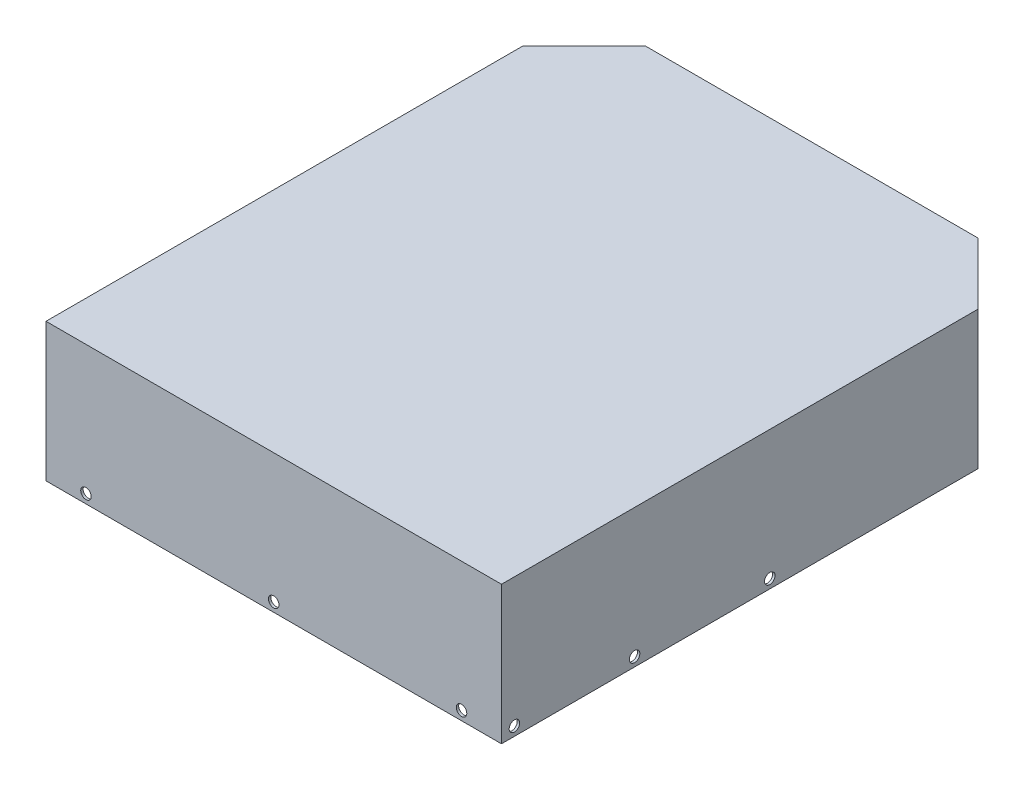
ISO-10303-21;
HEADER;
FILE_DESCRIPTION(('STEP AP214'),'2;1');
FILE_NAME('part.step','',(''),(''),'','','');
FILE_SCHEMA(('AUTOMOTIVE_DESIGN { 1 0 10303 214 1 1 1 1 }'));
ENDSEC;
DATA;
#1=APPLICATION_CONTEXT('core data for automotive mechanical design processes');
#2=APPLICATION_PROTOCOL_DEFINITION('international standard','automotive_design',2000,#1);
#3=PRODUCT_CONTEXT('',#1,'mechanical');
#4=PRODUCT('Part','Part','',(#3));
#5=PRODUCT_RELATED_PRODUCT_CATEGORY('part','',(#4));
#6=PRODUCT_DEFINITION_FORMATION('','',#4);
#7=PRODUCT_DEFINITION_CONTEXT('part definition',#1,'design');
#8=PRODUCT_DEFINITION('design','',#6,#7);
#9=PRODUCT_DEFINITION_SHAPE('','',#8);
#10=(LENGTH_UNIT() NAMED_UNIT(*) SI_UNIT(.MILLI.,.METRE.));
#11=(NAMED_UNIT(*) PLANE_ANGLE_UNIT() SI_UNIT($,.RADIAN.));
#12=(NAMED_UNIT(*) SI_UNIT($,.STERADIAN.) SOLID_ANGLE_UNIT());
#13=UNCERTAINTY_MEASURE_WITH_UNIT(LENGTH_MEASURE(1.E-05),#10,'distance_accuracy_value','');
#14=(GEOMETRIC_REPRESENTATION_CONTEXT(3) GLOBAL_UNCERTAINTY_ASSIGNED_CONTEXT((#13)) GLOBAL_UNIT_ASSIGNED_CONTEXT((#10,
#11,#12)) REPRESENTATION_CONTEXT('',''));
#15=CARTESIAN_POINT('',(0.,0.,0.));
#16=DIRECTION('',(0.,0.,1.));
#17=DIRECTION('',(1.,0.,0.));
#18=AXIS2_PLACEMENT_3D('',#15,#16,#17);
#19=CARTESIAN_POINT('',(-151.6,92.,0.));
#20=DIRECTION('',(0.,0.,-1.));
#21=DIRECTION('',(-1.,0.,0.));
#22=AXIS2_PLACEMENT_3D('',#19,#20,#21);
#23=PLANE('',#22);
#24=CARTESIAN_POINT('',(-125.,6.00000000000001,0.));
#25=DIRECTION('',(0.,0.,1.));
#26=DIRECTION('',(1.,0.,0.));
#27=AXIS2_PLACEMENT_3D('',#24,#25,#26);
#28=CIRCLE('',#27,3.49999999999999);
#29=CARTESIAN_POINT('',(-121.5,6.00000000000001,0.));
#30=VERTEX_POINT('',#29);
#31=EDGE_CURVE('E248',#30,#30,#28,.T.);
#32=ORIENTED_EDGE('',*,*,#31,.F.);
#33=EDGE_LOOP('',(#32));
#34=FACE_BOUND('',#33,.T.);
#35=DIRECTION('',(1.,0.,0.));
#36=VECTOR('',#35,1.);
#37=CARTESIAN_POINT('',(-151.6,0.,0.));
#38=LINE('',#37,#36);
#39=CARTESIAN_POINT('',(-151.6,0.,0.));
#40=VERTEX_POINT('',#39);
#41=CARTESIAN_POINT('',(151.6,0.,0.));
#42=VERTEX_POINT('',#41);
#43=EDGE_CURVE('E193',#40,#42,#38,.T.);
#44=ORIENTED_EDGE('',*,*,#43,.T.);
#45=DIRECTION('',(0.,-1.,0.));
#46=VECTOR('',#45,1.);
#47=CARTESIAN_POINT('',(151.6,92.,0.));
#48=LINE('',#47,#46);
#49=CARTESIAN_POINT('',(151.6,92.,0.));
#50=VERTEX_POINT('',#49);
#51=EDGE_CURVE('E191',#50,#42,#48,.T.);
#52=ORIENTED_EDGE('',*,*,#51,.F.);
#53=DIRECTION('',(1.,0.,0.));
#54=VECTOR('',#53,1.);
#55=CARTESIAN_POINT('',(-151.6,92.,0.));
#56=LINE('',#55,#54);
#57=CARTESIAN_POINT('',(-151.6,92.,0.));
#58=VERTEX_POINT('',#57);
#59=EDGE_CURVE('E183',#58,#50,#56,.T.);
#60=ORIENTED_EDGE('',*,*,#59,.F.);
#61=DIRECTION('',(0.,-1.,0.));
#62=VECTOR('',#61,1.);
#63=CARTESIAN_POINT('',(-151.6,92.,0.));
#64=LINE('',#63,#62);
#65=EDGE_CURVE('E201',#58,#40,#64,.T.);
#66=ORIENTED_EDGE('',*,*,#65,.T.);
#67=EDGE_LOOP('',(#44,#52,#60,#66));
#68=FACE_BOUND('',#67,.T.);
#69=CARTESIAN_POINT('',(125.,6.00000000000001,0.));
#70=DIRECTION('',(0.,0.,1.));
#71=DIRECTION('',(1.,0.,0.));
#72=AXIS2_PLACEMENT_3D('',#69,#70,#71);
#73=CIRCLE('',#72,3.49999999999998);
#74=CARTESIAN_POINT('',(128.5,6.00000000000001,0.));
#75=VERTEX_POINT('',#74);
#76=EDGE_CURVE('E260',#75,#75,#73,.T.);
#77=ORIENTED_EDGE('',*,*,#76,.F.);
#78=EDGE_LOOP('',(#77));
#79=FACE_BOUND('',#78,.T.);
#80=CARTESIAN_POINT('',(0.,6.00000000000001,0.));
#81=DIRECTION('',(0.,0.,1.));
#82=DIRECTION('',(1.,0.,0.));
#83=AXIS2_PLACEMENT_3D('',#80,#81,#82);
#84=CIRCLE('',#83,3.49999999999999);
#85=CARTESIAN_POINT('',(3.49999999999999,6.00000000000001,0.));
#86=VERTEX_POINT('',#85);
#87=EDGE_CURVE('E254',#86,#86,#84,.T.);
#88=ORIENTED_EDGE('',*,*,#87,.F.);
#89=EDGE_LOOP('',(#88));
#90=FACE_BOUND('',#89,.T.);
#91=ADVANCED_FACE('F32',(#34,#68,#79,#90),#23,.F.);
#92=CARTESIAN_POINT('',(-151.6,0.,-358.2));
#93=DIRECTION('',(0.,-1.,0.));
#94=DIRECTION('',(0.,0.,-1.));
#95=AXIS2_PLACEMENT_3D('',#92,#93,#94);
#96=PLANE('',#95);
#97=DIRECTION('',(0.,0.,1.));
#98=VECTOR('',#97,1.);
#99=CARTESIAN_POINT('',(-151.6,0.,0.));
#100=LINE('',#99,#98);
#101=CARTESIAN_POINT('',(-151.6,0.,-317.2));
#102=VERTEX_POINT('',#101);
#103=EDGE_CURVE('E159',#102,#40,#100,.T.);
#104=ORIENTED_EDGE('',*,*,#103,.F.);
#105=DIRECTION('',(-0.707106781186549,0.,0.707106781186546));
#106=VECTOR('',#105,1.);
#107=CARTESIAN_POINT('',(-131.1,0.,-337.7));
#108=LINE('',#107,#106);
#109=CARTESIAN_POINT('',(-110.6,0.,-358.2));
#110=VERTEX_POINT('',#109);
#111=EDGE_CURVE('E209',#102,#110,#108,.F.);
#112=ORIENTED_EDGE('',*,*,#111,.T.);
#113=DIRECTION('',(-1.,0.,0.));
#114=VECTOR('',#113,1.);
#115=CARTESIAN_POINT('',(-151.6,0.,-358.2));
#116=LINE('',#115,#114);
#117=CARTESIAN_POINT('',(110.6,0.,-358.2));
#118=VERTEX_POINT('',#117);
#119=EDGE_CURVE('E184',#118,#110,#116,.T.);
#120=ORIENTED_EDGE('',*,*,#119,.F.);
#121=DIRECTION('',(-0.707106781186547,0.,-0.707106781186549));
#122=VECTOR('',#121,1.);
#123=CARTESIAN_POINT('',(-20.4999999999996,0.,-489.3));
#124=LINE('',#123,#122);
#125=CARTESIAN_POINT('',(151.6,0.,-317.2));
#126=VERTEX_POINT('',#125);
#127=EDGE_CURVE('E207',#118,#126,#124,.F.);
#128=ORIENTED_EDGE('',*,*,#127,.T.);
#129=DIRECTION('',(0.,0.,-1.));
#130=VECTOR('',#129,1.);
#131=CARTESIAN_POINT('',(151.6,0.,0.));
#132=LINE('',#131,#130);
#133=EDGE_CURVE('E195',#42,#126,#132,.T.);
#134=ORIENTED_EDGE('',*,*,#133,.F.);
#135=ORIENTED_EDGE('',*,*,#43,.F.);
#136=EDGE_LOOP('',(#104,#112,#120,#128,#134,#135));
#137=FACE_BOUND('',#136,.T.);
#138=DIRECTION('',(-0.707106781186549,0.,0.707106781186546));
#139=VECTOR('',#138,1.);
#140=CARTESIAN_POINT('',(-129.968629150102,0.,-336.568629150101));
#141=LINE('',#140,#139);
#142=CARTESIAN_POINT('',(-150.,0.,-316.537258300203));
#143=VERTEX_POINT('',#142);
#144=CARTESIAN_POINT('',(-109.937258300203,0.,-356.6));
#145=VERTEX_POINT('',#144);
#146=EDGE_CURVE('E171',#143,#145,#141,.F.);
#147=ORIENTED_EDGE('',*,*,#146,.F.);
#148=DIRECTION('',(0.,0.,1.));
#149=VECTOR('',#148,1.);
#150=CARTESIAN_POINT('',(-150.,0.,-358.2));
#151=LINE('',#150,#149);
#152=CARTESIAN_POINT('',(-150.,0.,-1.6));
#153=VERTEX_POINT('',#152);
#154=EDGE_CURVE('E172',#143,#153,#151,.T.);
#155=ORIENTED_EDGE('',*,*,#154,.T.);
#156=DIRECTION('',(1.,0.,0.));
#157=VECTOR('',#156,1.);
#158=CARTESIAN_POINT('',(-151.6,0.,-1.59999999999999));
#159=LINE('',#158,#157);
#160=CARTESIAN_POINT('',(150.,0.,-1.6));
#161=VERTEX_POINT('',#160);
#162=EDGE_CURVE('E149',#153,#161,#159,.T.);
#163=ORIENTED_EDGE('',*,*,#162,.T.);
#164=DIRECTION('',(0.,0.,-1.));
#165=VECTOR('',#164,1.);
#166=CARTESIAN_POINT('',(150.,0.,-358.2));
#167=LINE('',#166,#165);
#168=CARTESIAN_POINT('',(150.,0.,-316.537258300203));
#169=VERTEX_POINT('',#168);
#170=EDGE_CURVE('E49',#161,#169,#167,.T.);
#171=ORIENTED_EDGE('',*,*,#170,.T.);
#172=DIRECTION('',(-0.707106781186547,0.,-0.707106781186549));
#173=VECTOR('',#172,1.);
#174=CARTESIAN_POINT('',(-21.6313708498981,0.,-488.168629150101));
#175=LINE('',#174,#173);
#176=CARTESIAN_POINT('',(109.937258300203,0.,-356.6));
#177=VERTEX_POINT('',#176);
#178=EDGE_CURVE('E152',#177,#169,#175,.F.);
#179=ORIENTED_EDGE('',*,*,#178,.F.);
#180=DIRECTION('',(-1.,0.,0.));
#181=VECTOR('',#180,1.);
#182=CARTESIAN_POINT('',(-151.6,0.,-356.6));
#183=LINE('',#182,#181);
#184=EDGE_CURVE('E137',#177,#145,#183,.T.);
#185=ORIENTED_EDGE('',*,*,#184,.T.);
#186=EDGE_LOOP('',(#147,#155,#163,#171,#179,#185));
#187=FACE_BOUND('',#186,.T.);
#188=ADVANCED_FACE('F284',(#137,#187),#96,.T.);
#189=CARTESIAN_POINT('',(-151.6,92.,0.));
#190=DIRECTION('',(1.,0.,0.));
#191=DIRECTION('',(0.,0.,-1.));
#192=AXIS2_PLACEMENT_3D('',#189,#190,#191);
#193=PLANE('',#192);
#194=CARTESIAN_POINT('',(-151.6,6.00000000000001,-8.6));
#195=DIRECTION('',(-1.,0.,0.));
#196=DIRECTION('',(0.,0.,1.));
#197=AXIS2_PLACEMENT_3D('',#194,#195,#196);
#198=CIRCLE('',#197,3.49999999999999);
#199=CARTESIAN_POINT('',(-151.6,6.00000000000001,-5.10000000000001));
#200=VERTEX_POINT('',#199);
#201=EDGE_CURVE('E508',#200,#200,#198,.T.);
#202=ORIENTED_EDGE('',*,*,#201,.F.);
#203=EDGE_LOOP('',(#202));
#204=FACE_BOUND('',#203,.T.);
#205=CARTESIAN_POINT('',(-151.6,6.00000000000001,-88.6));
#206=DIRECTION('',(-1.,0.,0.));
#207=DIRECTION('',(0.,0.,1.));
#208=AXIS2_PLACEMENT_3D('',#205,#206,#207);
#209=CIRCLE('',#208,3.49999999999999);
#210=CARTESIAN_POINT('',(-151.6,6.00000000000001,-85.1));
#211=VERTEX_POINT('',#210);
#212=EDGE_CURVE('E233',#211,#211,#209,.T.);
#213=ORIENTED_EDGE('',*,*,#212,.F.);
#214=EDGE_LOOP('',(#213));
#215=FACE_BOUND('',#214,.T.);
#216=CARTESIAN_POINT('',(-151.6,6.00000000000001,-178.6));
#217=DIRECTION('',(-1.,0.,0.));
#218=DIRECTION('',(0.,0.,1.));
#219=AXIS2_PLACEMENT_3D('',#216,#217,#218);
#220=CIRCLE('',#219,3.49999999999999);
#221=CARTESIAN_POINT('',(-151.6,6.00000000000001,-175.1));
#222=VERTEX_POINT('',#221);
#223=EDGE_CURVE('E230',#222,#222,#220,.T.);
#224=ORIENTED_EDGE('',*,*,#223,.F.);
#225=EDGE_LOOP('',(#224));
#226=FACE_BOUND('',#225,.T.);
#227=DIRECTION('',(0.,0.,1.));
#228=VECTOR('',#227,1.);
#229=CARTESIAN_POINT('',(-151.6,92.,0.));
#230=LINE('',#229,#228);
#231=CARTESIAN_POINT('',(-151.6,92.,-317.2));
#232=VERTEX_POINT('',#231);
#233=EDGE_CURVE('E181',#232,#58,#230,.T.);
#234=ORIENTED_EDGE('',*,*,#233,.F.);
#235=DIRECTION('',(0.,-1.,0.));
#236=VECTOR('',#235,1.);
#237=CARTESIAN_POINT('',(-151.6,92.,-317.2));
#238=LINE('',#237,#236);
#239=EDGE_CURVE('E204',#232,#102,#238,.T.);
#240=ORIENTED_EDGE('',*,*,#239,.T.);
#241=ORIENTED_EDGE('',*,*,#103,.T.);
#242=ORIENTED_EDGE('',*,*,#65,.F.);
#243=EDGE_LOOP('',(#234,#240,#241,#242));
#244=FACE_BOUND('',#243,.T.);
#245=ADVANCED_FACE('F290',(#204,#215,#226,#244),#193,.F.);
#246=CARTESIAN_POINT('',(151.6,92.,0.));
#247=DIRECTION('',(-1.,0.,0.));
#248=DIRECTION('',(0.,0.,1.));
#249=AXIS2_PLACEMENT_3D('',#246,#247,#248);
#250=PLANE('',#249);
#251=CARTESIAN_POINT('',(151.6,6.00000000000001,-8.6));
#252=DIRECTION('',(-1.,0.,0.));
#253=DIRECTION('',(0.,0.,1.));
#254=AXIS2_PLACEMENT_3D('',#251,#252,#253);
#255=CIRCLE('',#254,3.49999999999996);
#256=CARTESIAN_POINT('',(151.6,6.00000000000001,-5.10000000000004));
#257=VERTEX_POINT('',#256);
#258=EDGE_CURVE('E338',#257,#257,#255,.T.);
#259=ORIENTED_EDGE('',*,*,#258,.T.);
#260=EDGE_LOOP('',(#259));
#261=FACE_BOUND('',#260,.T.);
#262=CARTESIAN_POINT('',(151.6,6.00000000000001,-88.6));
#263=DIRECTION('',(-1.,0.,0.));
#264=DIRECTION('',(0.,0.,1.));
#265=AXIS2_PLACEMENT_3D('',#262,#263,#264);
#266=CIRCLE('',#265,3.49999999999996);
#267=CARTESIAN_POINT('',(151.6,6.00000000000001,-85.1));
#268=VERTEX_POINT('',#267);
#269=EDGE_CURVE('E226',#268,#268,#266,.T.);
#270=ORIENTED_EDGE('',*,*,#269,.T.);
#271=EDGE_LOOP('',(#270));
#272=FACE_BOUND('',#271,.T.);
#273=CARTESIAN_POINT('',(151.6,6.00000000000001,-178.6));
#274=DIRECTION('',(-1.,0.,0.));
#275=DIRECTION('',(0.,0.,1.));
#276=AXIS2_PLACEMENT_3D('',#273,#274,#275);
#277=CIRCLE('',#276,3.49999999999996);
#278=CARTESIAN_POINT('',(151.6,6.00000000000001,-175.1));
#279=VERTEX_POINT('',#278);
#280=EDGE_CURVE('E222',#279,#279,#277,.T.);
#281=ORIENTED_EDGE('',*,*,#280,.T.);
#282=EDGE_LOOP('',(#281));
#283=FACE_BOUND('',#282,.T.);
#284=ORIENTED_EDGE('',*,*,#133,.T.);
#285=DIRECTION('',(0.,1.,0.));
#286=VECTOR('',#285,1.);
#287=CARTESIAN_POINT('',(151.6,92.,-317.2));
#288=LINE('',#287,#286);
#289=CARTESIAN_POINT('',(151.6,92.,-317.2));
#290=VERTEX_POINT('',#289);
#291=EDGE_CURVE('E11',#126,#290,#288,.T.);
#292=ORIENTED_EDGE('',*,*,#291,.T.);
#293=DIRECTION('',(0.,0.,-1.));
#294=VECTOR('',#293,1.);
#295=CARTESIAN_POINT('',(151.6,92.,0.));
#296=LINE('',#295,#294);
#297=EDGE_CURVE('E186',#50,#290,#296,.T.);
#298=ORIENTED_EDGE('',*,*,#297,.F.);
#299=ORIENTED_EDGE('',*,*,#51,.T.);
#300=EDGE_LOOP('',(#284,#292,#298,#299));
#301=FACE_BOUND('',#300,.T.);
#302=ADVANCED_FACE('F297',(#261,#272,#283,#301),#250,.F.);
#303=CARTESIAN_POINT('',(-151.6,92.,-358.2));
#304=DIRECTION('',(0.,0.,1.));
#305=DIRECTION('',(1.,0.,0.));
#306=AXIS2_PLACEMENT_3D('',#303,#304,#305);
#307=PLANE('',#306);
#308=ORIENTED_EDGE('',*,*,#119,.T.);
#309=DIRECTION('',(0.,1.,0.));
#310=VECTOR('',#309,1.);
#311=CARTESIAN_POINT('',(-110.6,92.,-358.2));
#312=LINE('',#311,#310);
#313=CARTESIAN_POINT('',(-110.6,92.,-358.2));
#314=VERTEX_POINT('',#313);
#315=EDGE_CURVE('E214',#110,#314,#312,.T.);
#316=ORIENTED_EDGE('',*,*,#315,.T.);
#317=DIRECTION('',(-1.,0.,0.));
#318=VECTOR('',#317,1.);
#319=CARTESIAN_POINT('',(-151.6,92.,-358.2));
#320=LINE('',#319,#318);
#321=CARTESIAN_POINT('',(110.6,92.,-358.2));
#322=VERTEX_POINT('',#321);
#323=EDGE_CURVE('E188',#322,#314,#320,.T.);
#324=ORIENTED_EDGE('',*,*,#323,.F.);
#325=DIRECTION('',(0.,-1.,0.));
#326=VECTOR('',#325,1.);
#327=CARTESIAN_POINT('',(110.6,92.,-358.2));
#328=LINE('',#327,#326);
#329=EDGE_CURVE('E211',#322,#118,#328,.T.);
#330=ORIENTED_EDGE('',*,*,#329,.T.);
#331=EDGE_LOOP('',(#308,#316,#324,#330));
#332=FACE_BOUND('',#331,.T.);
#333=ADVANCED_FACE('F310',(#332),#307,.F.);
#334=CARTESIAN_POINT('',(-151.6,92.,-358.2));
#335=DIRECTION('',(0.,-1.,0.));
#336=DIRECTION('',(0.,0.,-1.));
#337=AXIS2_PLACEMENT_3D('',#334,#335,#336);
#338=PLANE('',#337);
#339=ORIENTED_EDGE('',*,*,#323,.T.);
#340=DIRECTION('',(0.707106781186549,0.,-0.707106781186546));
#341=VECTOR('',#340,1.);
#342=CARTESIAN_POINT('',(-151.6,92.,-317.2));
#343=LINE('',#342,#341);
#344=EDGE_CURVE('E41',#314,#232,#343,.F.);
#345=ORIENTED_EDGE('',*,*,#344,.T.);
#346=ORIENTED_EDGE('',*,*,#233,.T.);
#347=ORIENTED_EDGE('',*,*,#59,.T.);
#348=ORIENTED_EDGE('',*,*,#297,.T.);
#349=DIRECTION('',(0.707106781186547,0.,0.707106781186549));
#350=VECTOR('',#349,1.);
#351=CARTESIAN_POINT('',(110.6,92.,-358.2));
#352=LINE('',#351,#350);
#353=EDGE_CURVE('E216',#290,#322,#352,.F.);
#354=ORIENTED_EDGE('',*,*,#353,.T.);
#355=EDGE_LOOP('',(#339,#345,#346,#347,#348,#354));
#356=FACE_BOUND('',#355,.T.);
#357=ADVANCED_FACE('F303',(#356),#338,.F.);
#358=CARTESIAN_POINT('',(-151.6,92.,-317.2));
#359=DIRECTION('',(0.707106781186546,0.,0.707106781186549));
#360=DIRECTION('',(0.707106781186549,0.,-0.707106781186546));
#361=AXIS2_PLACEMENT_3D('',#358,#359,#360);
#362=PLANE('',#361);
#363=ORIENTED_EDGE('',*,*,#344,.F.);
#364=ORIENTED_EDGE('',*,*,#315,.F.);
#365=ORIENTED_EDGE('',*,*,#111,.F.);
#366=ORIENTED_EDGE('',*,*,#239,.F.);
#367=EDGE_LOOP('',(#363,#364,#365,#366));
#368=FACE_BOUND('',#367,.T.);
#369=ADVANCED_FACE('F301',(#368),#362,.F.);
#370=CARTESIAN_POINT('',(110.6,92.,-358.2));
#371=DIRECTION('',(-0.707106781186549,0.,0.707106781186547));
#372=DIRECTION('',(0.707106781186547,0.,0.707106781186549));
#373=AXIS2_PLACEMENT_3D('',#370,#371,#372);
#374=PLANE('',#373);
#375=ORIENTED_EDGE('',*,*,#353,.F.);
#376=ORIENTED_EDGE('',*,*,#291,.F.);
#377=ORIENTED_EDGE('',*,*,#127,.F.);
#378=ORIENTED_EDGE('',*,*,#329,.F.);
#379=EDGE_LOOP('',(#375,#376,#377,#378));
#380=FACE_BOUND('',#379,.T.);
#381=ADVANCED_FACE('F34',(#380),#374,.F.);
#382=CARTESIAN_POINT('',(-150.,92.,0.));
#383=DIRECTION('',(1.,0.,0.));
#384=DIRECTION('',(0.,0.,-1.));
#385=AXIS2_PLACEMENT_3D('',#382,#383,#384);
#386=PLANE('',#385);
#387=CARTESIAN_POINT('',(-150.,6.00000000000001,-8.6));
#388=DIRECTION('',(1.,0.,0.));
#389=DIRECTION('',(0.,0.,-1.));
#390=AXIS2_PLACEMENT_3D('',#387,#388,#389);
#391=CIRCLE('',#390,3.49999999999998);
#392=CARTESIAN_POINT('',(-150.,6.00000000000001,-12.1));
#393=VERTEX_POINT('',#392);
#394=EDGE_CURVE('E238',#393,#393,#391,.T.);
#395=ORIENTED_EDGE('',*,*,#394,.F.);
#396=EDGE_LOOP('',(#395));
#397=FACE_BOUND('',#396,.T.);
#398=CARTESIAN_POINT('',(-150.,6.00000000000001,-88.6));
#399=DIRECTION('',(1.,0.,0.));
#400=DIRECTION('',(0.,0.,-1.));
#401=AXIS2_PLACEMENT_3D('',#398,#399,#400);
#402=CIRCLE('',#401,3.49999999999998);
#403=CARTESIAN_POINT('',(-150.,6.00000000000001,-92.1));
#404=VERTEX_POINT('',#403);
#405=EDGE_CURVE('E225',#404,#404,#402,.T.);
#406=ORIENTED_EDGE('',*,*,#405,.F.);
#407=EDGE_LOOP('',(#406));
#408=FACE_BOUND('',#407,.T.);
#409=CARTESIAN_POINT('',(-150.,6.00000000000001,-178.6));
#410=DIRECTION('',(1.,0.,0.));
#411=DIRECTION('',(0.,0.,-1.));
#412=AXIS2_PLACEMENT_3D('',#409,#410,#411);
#413=CIRCLE('',#412,3.49999999999998);
#414=CARTESIAN_POINT('',(-150.,6.00000000000001,-182.1));
#415=VERTEX_POINT('',#414);
#416=EDGE_CURVE('E219',#415,#415,#413,.T.);
#417=ORIENTED_EDGE('',*,*,#416,.F.);
#418=EDGE_LOOP('',(#417));
#419=FACE_BOUND('',#418,.T.);
#420=DIRECTION('',(0.,0.,1.));
#421=VECTOR('',#420,1.);
#422=CARTESIAN_POINT('',(-150.,90.4,-358.2));
#423=LINE('',#422,#421);
#424=CARTESIAN_POINT('',(-150.,90.4,-316.537258300203));
#425=VERTEX_POINT('',#424);
#426=CARTESIAN_POINT('',(-150.,90.4,-1.6));
#427=VERTEX_POINT('',#426);
#428=EDGE_CURVE('E126',#425,#427,#423,.T.);
#429=ORIENTED_EDGE('',*,*,#428,.T.);
#430=DIRECTION('',(0.,-1.,0.));
#431=VECTOR('',#430,1.);
#432=CARTESIAN_POINT('',(-150.,92.,-1.6));
#433=LINE('',#432,#431);
#434=EDGE_CURVE('E131',#427,#153,#433,.T.);
#435=ORIENTED_EDGE('',*,*,#434,.T.);
#436=ORIENTED_EDGE('',*,*,#154,.F.);
#437=DIRECTION('',(0.,1.,0.));
#438=VECTOR('',#437,1.);
#439=CARTESIAN_POINT('',(-150.,92.,-316.537258300203));
#440=LINE('',#439,#438);
#441=EDGE_CURVE('E133',#425,#143,#440,.F.);
#442=ORIENTED_EDGE('',*,*,#441,.F.);
#443=EDGE_LOOP('',(#429,#435,#436,#442));
#444=FACE_BOUND('',#443,.T.);
#445=ADVANCED_FACE('F128',(#397,#408,#419,#444),#386,.T.);
#446=CARTESIAN_POINT('',(-151.6,92.,-1.6));
#447=DIRECTION('',(0.,0.,-1.));
#448=DIRECTION('',(-1.,0.,0.));
#449=AXIS2_PLACEMENT_3D('',#446,#447,#448);
#450=PLANE('',#449);
#451=CARTESIAN_POINT('',(-125.,6.00000000000001,-1.6));
#452=DIRECTION('',(0.,0.,-1.));
#453=DIRECTION('',(-1.,0.,0.));
#454=AXIS2_PLACEMENT_3D('',#451,#452,#453);
#455=CIRCLE('',#454,3.5);
#456=CARTESIAN_POINT('',(-128.5,6.00000000000001,-1.6));
#457=VERTEX_POINT('',#456);
#458=EDGE_CURVE('E251',#457,#457,#455,.T.);
#459=ORIENTED_EDGE('',*,*,#458,.F.);
#460=EDGE_LOOP('',(#459));
#461=FACE_BOUND('',#460,.T.);
#462=CARTESIAN_POINT('',(0.,6.00000000000001,-1.6));
#463=DIRECTION('',(0.,0.,-1.));
#464=DIRECTION('',(-1.,0.,0.));
#465=AXIS2_PLACEMENT_3D('',#462,#463,#464);
#466=CIRCLE('',#465,3.49999999999999);
#467=CARTESIAN_POINT('',(-3.49999999999999,6.00000000000001,-1.6));
#468=VERTEX_POINT('',#467);
#469=EDGE_CURVE('E257',#468,#468,#466,.T.);
#470=ORIENTED_EDGE('',*,*,#469,.F.);
#471=EDGE_LOOP('',(#470));
#472=FACE_BOUND('',#471,.T.);
#473=CARTESIAN_POINT('',(125.,6.00000000000001,-1.6));
#474=DIRECTION('',(0.,0.,-1.));
#475=DIRECTION('',(-1.,0.,0.));
#476=AXIS2_PLACEMENT_3D('',#473,#474,#475);
#477=CIRCLE('',#476,3.49999999999999);
#478=CARTESIAN_POINT('',(121.5,6.00000000000001,-1.6));
#479=VERTEX_POINT('',#478);
#480=EDGE_CURVE('E174',#479,#479,#477,.T.);
#481=ORIENTED_EDGE('',*,*,#480,.F.);
#482=EDGE_LOOP('',(#481));
#483=FACE_BOUND('',#482,.T.);
#484=ORIENTED_EDGE('',*,*,#162,.F.);
#485=ORIENTED_EDGE('',*,*,#434,.F.);
#486=DIRECTION('',(1.,0.,0.));
#487=VECTOR('',#486,1.);
#488=CARTESIAN_POINT('',(-151.6,90.4,-1.59999999999999));
#489=LINE('',#488,#487);
#490=CARTESIAN_POINT('',(150.,90.4,-1.6));
#491=VERTEX_POINT('',#490);
#492=EDGE_CURVE('E136',#427,#491,#489,.T.);
#493=ORIENTED_EDGE('',*,*,#492,.T.);
#494=DIRECTION('',(0.,-1.,0.));
#495=VECTOR('',#494,1.);
#496=CARTESIAN_POINT('',(150.,92.,-1.6));
#497=LINE('',#496,#495);
#498=EDGE_CURVE('E150',#491,#161,#497,.T.);
#499=ORIENTED_EDGE('',*,*,#498,.T.);
#500=EDGE_LOOP('',(#484,#485,#493,#499));
#501=FACE_BOUND('',#500,.T.);
#502=ADVANCED_FACE('F147',(#461,#472,#483,#501),#450,.T.);
#503=CARTESIAN_POINT('',(150.,92.,0.));
#504=DIRECTION('',(-1.,0.,0.));
#505=DIRECTION('',(0.,0.,1.));
#506=AXIS2_PLACEMENT_3D('',#503,#504,#505);
#507=PLANE('',#506);
#508=CARTESIAN_POINT('',(150.,6.00000000000001,-8.6));
#509=DIRECTION('',(-1.,0.,0.));
#510=DIRECTION('',(0.,0.,1.));
#511=AXIS2_PLACEMENT_3D('',#508,#509,#510);
#512=CIRCLE('',#511,3.49999999999998);
#513=CARTESIAN_POINT('',(150.,6.00000000000001,-5.10000000000002));
#514=VERTEX_POINT('',#513);
#515=EDGE_CURVE('E36',#514,#514,#512,.T.);
#516=ORIENTED_EDGE('',*,*,#515,.F.);
#517=EDGE_LOOP('',(#516));
#518=FACE_BOUND('',#517,.T.);
#519=CARTESIAN_POINT('',(150.,6.00000000000001,-88.6));
#520=DIRECTION('',(-1.,0.,0.));
#521=DIRECTION('',(0.,0.,1.));
#522=AXIS2_PLACEMENT_3D('',#519,#520,#521);
#523=CIRCLE('',#522,3.49999999999998);
#524=CARTESIAN_POINT('',(150.,6.00000000000001,-85.1));
#525=VERTEX_POINT('',#524);
#526=EDGE_CURVE('E223',#525,#525,#523,.T.);
#527=ORIENTED_EDGE('',*,*,#526,.F.);
#528=EDGE_LOOP('',(#527));
#529=FACE_BOUND('',#528,.T.);
#530=CARTESIAN_POINT('',(150.,6.00000000000001,-178.6));
#531=DIRECTION('',(-1.,0.,0.));
#532=DIRECTION('',(0.,0.,1.));
#533=AXIS2_PLACEMENT_3D('',#530,#531,#532);
#534=CIRCLE('',#533,3.49999999999998);
#535=CARTESIAN_POINT('',(150.,6.00000000000001,-175.1));
#536=VERTEX_POINT('',#535);
#537=EDGE_CURVE('E221',#536,#536,#534,.T.);
#538=ORIENTED_EDGE('',*,*,#537,.F.);
#539=EDGE_LOOP('',(#538));
#540=FACE_BOUND('',#539,.T.);
#541=ORIENTED_EDGE('',*,*,#170,.F.);
#542=ORIENTED_EDGE('',*,*,#498,.F.);
#543=DIRECTION('',(0.,0.,-1.));
#544=VECTOR('',#543,1.);
#545=CARTESIAN_POINT('',(150.,90.4,-358.2));
#546=LINE('',#545,#544);
#547=CARTESIAN_POINT('',(150.,90.4,-316.537258300203));
#548=VERTEX_POINT('',#547);
#549=EDGE_CURVE('E144',#491,#548,#546,.T.);
#550=ORIENTED_EDGE('',*,*,#549,.T.);
#551=DIRECTION('',(0.,-1.,0.));
#552=VECTOR('',#551,1.);
#553=CARTESIAN_POINT('',(150.,92.,-316.537258300203));
#554=LINE('',#553,#552);
#555=EDGE_CURVE('E157',#169,#548,#554,.F.);
#556=ORIENTED_EDGE('',*,*,#555,.F.);
#557=EDGE_LOOP('',(#541,#542,#550,#556));
#558=FACE_BOUND('',#557,.T.);
#559=ADVANCED_FACE('F269',(#518,#529,#540,#558),#507,.T.);
#560=CARTESIAN_POINT('',(-151.6,92.,-356.6));
#561=DIRECTION('',(0.,0.,1.));
#562=DIRECTION('',(1.,0.,0.));
#563=AXIS2_PLACEMENT_3D('',#560,#561,#562);
#564=PLANE('',#563);
#565=ORIENTED_EDGE('',*,*,#184,.F.);
#566=DIRECTION('',(0.,1.,0.));
#567=VECTOR('',#566,1.);
#568=CARTESIAN_POINT('',(109.937258300203,92.,-356.6));
#569=LINE('',#568,#567);
#570=CARTESIAN_POINT('',(109.937258300203,90.4,-356.6));
#571=VERTEX_POINT('',#570);
#572=EDGE_CURVE('E169',#571,#177,#569,.F.);
#573=ORIENTED_EDGE('',*,*,#572,.F.);
#574=DIRECTION('',(-1.,0.,0.));
#575=VECTOR('',#574,1.);
#576=CARTESIAN_POINT('',(-151.6,90.4,-356.6));
#577=LINE('',#576,#575);
#578=CARTESIAN_POINT('',(-109.937258300203,90.4,-356.6));
#579=VERTEX_POINT('',#578);
#580=EDGE_CURVE('E154',#571,#579,#577,.T.);
#581=ORIENTED_EDGE('',*,*,#580,.T.);
#582=DIRECTION('',(0.,-1.,0.));
#583=VECTOR('',#582,1.);
#584=CARTESIAN_POINT('',(-109.937258300203,92.,-356.6));
#585=LINE('',#584,#583);
#586=EDGE_CURVE('E167',#145,#579,#585,.F.);
#587=ORIENTED_EDGE('',*,*,#586,.F.);
#588=EDGE_LOOP('',(#565,#573,#581,#587));
#589=FACE_BOUND('',#588,.T.);
#590=ADVANCED_FACE('F276',(#589),#564,.T.);
#591=CARTESIAN_POINT('',(-151.6,90.4,-358.2));
#592=DIRECTION('',(0.,-1.,0.));
#593=DIRECTION('',(0.,0.,-1.));
#594=AXIS2_PLACEMENT_3D('',#591,#592,#593);
#595=PLANE('',#594);
#596=ORIENTED_EDGE('',*,*,#580,.F.);
#597=DIRECTION('',(0.707106781186547,0.,0.707106781186549));
#598=VECTOR('',#597,1.);
#599=CARTESIAN_POINT('',(109.468629150102,90.4,-357.068629150102));
#600=LINE('',#599,#598);
#601=EDGE_CURVE('E165',#548,#571,#600,.F.);
#602=ORIENTED_EDGE('',*,*,#601,.F.);
#603=ORIENTED_EDGE('',*,*,#549,.F.);
#604=ORIENTED_EDGE('',*,*,#492,.F.);
#605=ORIENTED_EDGE('',*,*,#428,.F.);
#606=DIRECTION('',(0.707106781186549,0.,-0.707106781186546));
#607=VECTOR('',#606,1.);
#608=CARTESIAN_POINT('',(-150.468629150102,90.4,-316.068629150102));
#609=LINE('',#608,#607);
#610=EDGE_CURVE('E160',#579,#425,#609,.F.);
#611=ORIENTED_EDGE('',*,*,#610,.F.);
#612=EDGE_LOOP('',(#596,#602,#603,#604,#605,#611));
#613=FACE_BOUND('',#612,.T.);
#614=ADVANCED_FACE('F141',(#613),#595,.T.);
#615=CARTESIAN_POINT('',(-150.468629150102,92.,-316.068629150102));
#616=DIRECTION('',(0.707106781186546,0.,0.707106781186549));
#617=DIRECTION('',(0.707106781186549,0.,-0.707106781186546));
#618=AXIS2_PLACEMENT_3D('',#615,#616,#617);
#619=PLANE('',#618);
#620=ORIENTED_EDGE('',*,*,#610,.T.);
#621=ORIENTED_EDGE('',*,*,#441,.T.);
#622=ORIENTED_EDGE('',*,*,#146,.T.);
#623=ORIENTED_EDGE('',*,*,#586,.T.);
#624=EDGE_LOOP('',(#620,#621,#622,#623));
#625=FACE_BOUND('',#624,.T.);
#626=ADVANCED_FACE('F371',(#625),#619,.T.);
#627=CARTESIAN_POINT('',(109.468629150102,92.,-357.068629150102));
#628=DIRECTION('',(-0.707106781186549,0.,0.707106781186547));
#629=DIRECTION('',(0.707106781186547,0.,0.707106781186549));
#630=AXIS2_PLACEMENT_3D('',#627,#628,#629);
#631=PLANE('',#630);
#632=ORIENTED_EDGE('',*,*,#601,.T.);
#633=ORIENTED_EDGE('',*,*,#572,.T.);
#634=ORIENTED_EDGE('',*,*,#178,.T.);
#635=ORIENTED_EDGE('',*,*,#555,.T.);
#636=EDGE_LOOP('',(#632,#633,#634,#635));
#637=FACE_BOUND('',#636,.T.);
#638=ADVANCED_FACE('F366',(#637),#631,.T.);
#639=CARTESIAN_POINT('',(125.,6.00000000000001,0.));
#640=DIRECTION('',(0.,0.,1.));
#641=DIRECTION('',(1.,0.,0.));
#642=AXIS2_PLACEMENT_3D('',#639,#640,#641);
#643=CYLINDRICAL_SURFACE('',#642,3.49999999999999);
#644=ORIENTED_EDGE('',*,*,#76,.T.);
#645=EDGE_LOOP('',(#644));
#646=FACE_BOUND('',#645,.T.);
#647=ORIENTED_EDGE('',*,*,#480,.T.);
#648=EDGE_LOOP('',(#647));
#649=FACE_BOUND('',#648,.T.);
#650=ADVANCED_FACE('F266',(#646,#649),#643,.F.);
#651=CARTESIAN_POINT('',(0.,6.00000000000001,0.));
#652=DIRECTION('',(0.,0.,1.));
#653=DIRECTION('',(1.,0.,0.));
#654=AXIS2_PLACEMENT_3D('',#651,#652,#653);
#655=CYLINDRICAL_SURFACE('',#654,3.49999999999999);
#656=ORIENTED_EDGE('',*,*,#87,.T.);
#657=EDGE_LOOP('',(#656));
#658=FACE_BOUND('',#657,.T.);
#659=ORIENTED_EDGE('',*,*,#469,.T.);
#660=EDGE_LOOP('',(#659));
#661=FACE_BOUND('',#660,.T.);
#662=ADVANCED_FACE('F360',(#658,#661),#655,.F.);
#663=CARTESIAN_POINT('',(-125.,6.00000000000001,0.));
#664=DIRECTION('',(0.,0.,1.));
#665=DIRECTION('',(1.,0.,0.));
#666=AXIS2_PLACEMENT_3D('',#663,#664,#665);
#667=CYLINDRICAL_SURFACE('',#666,3.5);
#668=ORIENTED_EDGE('',*,*,#31,.T.);
#669=EDGE_LOOP('',(#668));
#670=FACE_BOUND('',#669,.T.);
#671=ORIENTED_EDGE('',*,*,#458,.T.);
#672=EDGE_LOOP('',(#671));
#673=FACE_BOUND('',#672,.T.);
#674=ADVANCED_FACE('F354',(#670,#673),#667,.F.);
#675=CARTESIAN_POINT('',(-151.6,6.00000000000001,-178.6));
#676=DIRECTION('',(-1.,0.,0.));
#677=DIRECTION('',(0.,0.,1.));
#678=AXIS2_PLACEMENT_3D('',#675,#676,#677);
#679=CYLINDRICAL_SURFACE('',#678,3.49999999999998);
#680=ORIENTED_EDGE('',*,*,#416,.T.);
#681=EDGE_LOOP('',(#680));
#682=FACE_BOUND('',#681,.T.);
#683=ORIENTED_EDGE('',*,*,#223,.T.);
#684=EDGE_LOOP('',(#683));
#685=FACE_BOUND('',#684,.T.);
#686=ADVANCED_FACE('F345',(#682,#685),#679,.F.);
#687=ORIENTED_EDGE('',*,*,#537,.T.);
#688=EDGE_LOOP('',(#687));
#689=FACE_BOUND('',#688,.T.);
#690=ORIENTED_EDGE('',*,*,#280,.F.);
#691=EDGE_LOOP('',(#690));
#692=FACE_BOUND('',#691,.T.);
#693=ADVANCED_FACE('F342',(#689,#692),#679,.F.);
#694=CARTESIAN_POINT('',(-151.6,6.00000000000001,-88.6));
#695=DIRECTION('',(-1.,0.,0.));
#696=DIRECTION('',(0.,0.,1.));
#697=AXIS2_PLACEMENT_3D('',#694,#695,#696);
#698=CYLINDRICAL_SURFACE('',#697,3.49999999999998);
#699=ORIENTED_EDGE('',*,*,#526,.T.);
#700=EDGE_LOOP('',(#699));
#701=FACE_BOUND('',#700,.T.);
#702=ORIENTED_EDGE('',*,*,#269,.F.);
#703=EDGE_LOOP('',(#702));
#704=FACE_BOUND('',#703,.T.);
#705=ADVANCED_FACE('F344',(#701,#704),#698,.F.);
#706=ORIENTED_EDGE('',*,*,#405,.T.);
#707=EDGE_LOOP('',(#706));
#708=FACE_BOUND('',#707,.T.);
#709=ORIENTED_EDGE('',*,*,#212,.T.);
#710=EDGE_LOOP('',(#709));
#711=FACE_BOUND('',#710,.T.);
#712=ADVANCED_FACE('F352',(#708,#711),#698,.F.);
#713=CARTESIAN_POINT('',(-151.6,6.00000000000001,-8.6));
#714=DIRECTION('',(-1.,0.,0.));
#715=DIRECTION('',(0.,0.,1.));
#716=AXIS2_PLACEMENT_3D('',#713,#714,#715);
#717=CYLINDRICAL_SURFACE('',#716,3.49999999999998);
#718=ORIENTED_EDGE('',*,*,#515,.T.);
#719=EDGE_LOOP('',(#718));
#720=FACE_BOUND('',#719,.T.);
#721=ORIENTED_EDGE('',*,*,#258,.F.);
#722=EDGE_LOOP('',(#721));
#723=FACE_BOUND('',#722,.T.);
#724=ADVANCED_FACE('F482',(#720,#723),#717,.F.);
#725=ORIENTED_EDGE('',*,*,#394,.T.);
#726=EDGE_LOOP('',(#725));
#727=FACE_BOUND('',#726,.T.);
#728=ORIENTED_EDGE('',*,*,#201,.T.);
#729=EDGE_LOOP('',(#728));
#730=FACE_BOUND('',#729,.T.);
#731=ADVANCED_FACE('F491',(#727,#730),#717,.F.);
#732=CLOSED_SHELL('',(#91,#188,#245,#302,#333,#357,#369,#381,#445,#502,#559,#590,#614,#626,#638,
#650,#662,#674,#686,#693,#705,#712,#724,#731));
#733=MANIFOLD_SOLID_BREP('B2',#732);
#734=ADVANCED_BREP_SHAPE_REPRESENTATION('',(#18,#733),#14);
#735=SHAPE_DEFINITION_REPRESENTATION(#9,#734);
ENDSEC;
END-ISO-10303-21;
